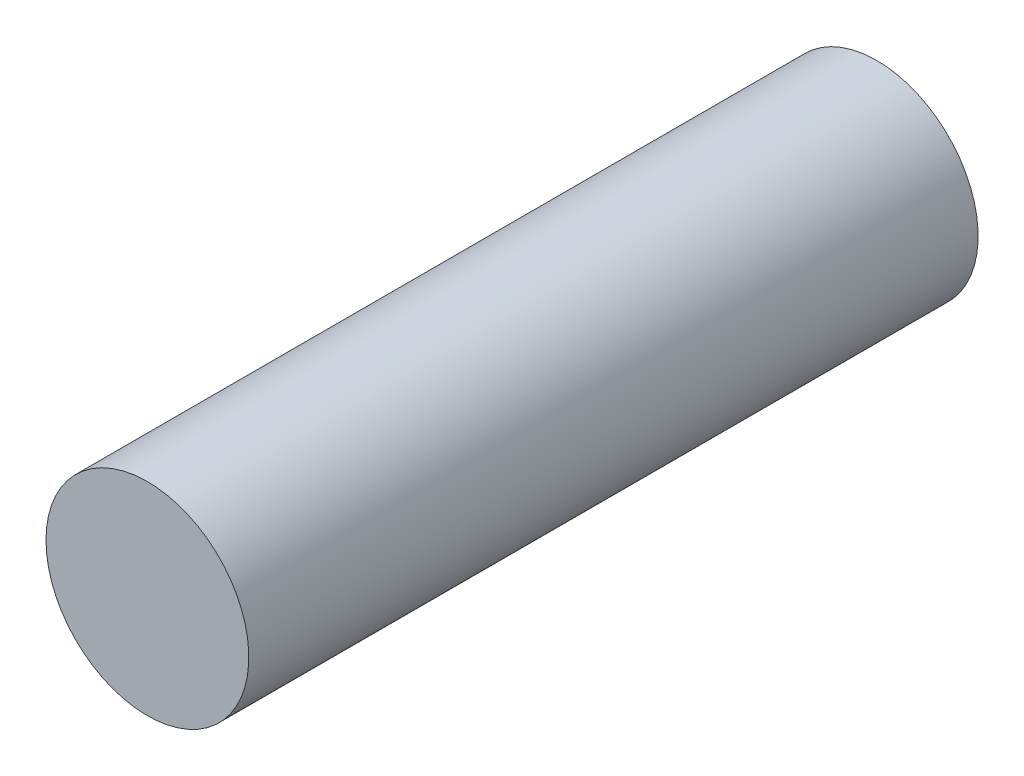
ISO-10303-21;
HEADER;
FILE_DESCRIPTION(('STEP AP214'),'2;1');
FILE_NAME('part.step','',(''),(''),'','','');
FILE_SCHEMA(('AUTOMOTIVE_DESIGN { 1 0 10303 214 1 1 1 1 }'));
ENDSEC;
DATA;
#1=APPLICATION_CONTEXT('core data for automotive mechanical design processes');
#2=APPLICATION_PROTOCOL_DEFINITION('international standard','automotive_design',2000,#1);
#3=PRODUCT_CONTEXT('',#1,'mechanical');
#4=PRODUCT('Part','Part','',(#3));
#5=PRODUCT_RELATED_PRODUCT_CATEGORY('part','',(#4));
#6=PRODUCT_DEFINITION_FORMATION('','',#4);
#7=PRODUCT_DEFINITION_CONTEXT('part definition',#1,'design');
#8=PRODUCT_DEFINITION('design','',#6,#7);
#9=PRODUCT_DEFINITION_SHAPE('','',#8);
#10=(LENGTH_UNIT() NAMED_UNIT(*) SI_UNIT(.MILLI.,.METRE.));
#11=(NAMED_UNIT(*) PLANE_ANGLE_UNIT() SI_UNIT($,.RADIAN.));
#12=(NAMED_UNIT(*) SI_UNIT($,.STERADIAN.) SOLID_ANGLE_UNIT());
#13=UNCERTAINTY_MEASURE_WITH_UNIT(LENGTH_MEASURE(1.E-05),#10,'distance_accuracy_value','');
#14=(GEOMETRIC_REPRESENTATION_CONTEXT(3) GLOBAL_UNCERTAINTY_ASSIGNED_CONTEXT((#13)) GLOBAL_UNIT_ASSIGNED_CONTEXT((#10,
#11,#12)) REPRESENTATION_CONTEXT('',''));
#15=CARTESIAN_POINT('',(0.,0.,0.));
#16=DIRECTION('',(0.,0.,1.));
#17=DIRECTION('',(1.,0.,0.));
#18=AXIS2_PLACEMENT_3D('',#15,#16,#17);
#19=CARTESIAN_POINT('',(0.,0.,11.8745));
#20=DIRECTION('',(0.,0.,-1.));
#21=DIRECTION('',(-1.,0.,0.));
#22=AXIS2_PLACEMENT_3D('',#19,#20,#21);
#23=CYLINDRICAL_SURFACE('',#22,3.302);
#24=CARTESIAN_POINT('',(0.,0.,11.8745));
#25=DIRECTION('',(0.,0.,1.));
#26=DIRECTION('',(1.,0.,0.));
#27=AXIS2_PLACEMENT_3D('',#24,#25,#26);
#28=CIRCLE('',#27,3.302);
#29=CARTESIAN_POINT('',(-3.302,0.,11.8745));
#30=VERTEX_POINT('',#29);
#31=EDGE_CURVE('E10',#30,#30,#28,.T.);
#32=CARTESIAN_POINT('',(0.,0.,-11.8745));
#33=DIRECTION('',(0.,0.,1.));
#34=DIRECTION('',(1.,0.,0.));
#35=AXIS2_PLACEMENT_3D('',#32,#33,#34);
#36=CIRCLE('',#35,3.302);
#37=CARTESIAN_POINT('',(-3.302,0.,-11.8745));
#38=VERTEX_POINT('',#37);
#39=EDGE_CURVE('E48',#38,#38,#36,.T.);
#40=CARTESIAN_POINT('',(-3.302,0.,11.8745));
#41=CARTESIAN_POINT('',(-3.302,0.,11.6271145833333));
#42=CARTESIAN_POINT('',(-3.302,0.,11.3797291666667));
#43=CARTESIAN_POINT('',(-3.302,0.,10.8849583333333));
#44=CARTESIAN_POINT('',(-3.302,0.,10.6375729166667));
#45=CARTESIAN_POINT('',(-3.302,0.,10.1428020833333));
#46=CARTESIAN_POINT('',(-3.302,0.,9.89541666666667));
#47=CARTESIAN_POINT('',(-3.302,0.,9.40064583333333));
#48=CARTESIAN_POINT('',(-3.302,0.,9.15326041666667));
#49=CARTESIAN_POINT('',(-3.302,0.,8.65848958333333));
#50=CARTESIAN_POINT('',(-3.302,0.,8.41110416666667));
#51=CARTESIAN_POINT('',(-3.302,0.,7.91633333333333));
#52=CARTESIAN_POINT('',(-3.302,0.,7.66894791666667));
#53=CARTESIAN_POINT('',(-3.302,0.,7.17417708333333));
#54=CARTESIAN_POINT('',(-3.302,0.,6.92679166666667));
#55=CARTESIAN_POINT('',(-3.302,0.,6.43202083333333));
#56=CARTESIAN_POINT('',(-3.302,0.,6.18463541666666));
#57=CARTESIAN_POINT('',(-3.302,0.,5.68986458333333));
#58=CARTESIAN_POINT('',(-3.302,0.,5.44247916666666));
#59=CARTESIAN_POINT('',(-3.302,0.,4.94770833333333));
#60=CARTESIAN_POINT('',(-3.302,0.,4.70032291666666));
#61=CARTESIAN_POINT('',(-3.302,0.,4.20555208333333));
#62=CARTESIAN_POINT('',(-3.302,0.,3.95816666666667));
#63=CARTESIAN_POINT('',(-3.302,0.,3.46339583333333));
#64=CARTESIAN_POINT('',(-3.302,0.,3.21601041666667));
#65=CARTESIAN_POINT('',(-3.302,0.,2.72123958333333));
#66=CARTESIAN_POINT('',(-3.302,0.,2.47385416666667));
#67=CARTESIAN_POINT('',(-3.302,0.,1.97908333333333));
#68=CARTESIAN_POINT('',(-3.302,0.,1.73169791666667));
#69=CARTESIAN_POINT('',(-3.302,0.,1.23692708333333));
#70=CARTESIAN_POINT('',(-3.302,0.,0.989541666666666));
#71=CARTESIAN_POINT('',(-3.302,0.,0.494770833333332));
#72=CARTESIAN_POINT('',(-3.302,0.,0.247385416666665));
#73=CARTESIAN_POINT('',(-3.302,0.,-0.247385416666669));
#74=CARTESIAN_POINT('',(-3.302,0.,-0.494770833333336));
#75=CARTESIAN_POINT('',(-3.302,0.,-0.989541666666669));
#76=CARTESIAN_POINT('',(-3.302,0.,-1.23692708333334));
#77=CARTESIAN_POINT('',(-3.302,0.,-1.73169791666667));
#78=CARTESIAN_POINT('',(-3.302,0.,-1.97908333333334));
#79=CARTESIAN_POINT('',(-3.302,0.,-2.47385416666667));
#80=CARTESIAN_POINT('',(-3.302,0.,-2.72123958333334));
#81=CARTESIAN_POINT('',(-3.302,0.,-3.21601041666667));
#82=CARTESIAN_POINT('',(-3.302,0.,-3.46339583333334));
#83=CARTESIAN_POINT('',(-3.302,0.,-3.95816666666667));
#84=CARTESIAN_POINT('',(-3.302,0.,-4.20555208333333));
#85=CARTESIAN_POINT('',(-3.302,0.,-4.70032291666667));
#86=CARTESIAN_POINT('',(-3.302,0.,-4.94770833333333));
#87=CARTESIAN_POINT('',(-3.302,0.,-5.44247916666667));
#88=CARTESIAN_POINT('',(-3.302,0.,-5.68986458333333));
#89=CARTESIAN_POINT('',(-3.302,0.,-6.18463541666667));
#90=CARTESIAN_POINT('',(-3.302,0.,-6.43202083333334));
#91=CARTESIAN_POINT('',(-3.302,0.,-6.92679166666667));
#92=CARTESIAN_POINT('',(-3.302,0.,-7.17417708333334));
#93=CARTESIAN_POINT('',(-3.302,0.,-7.66894791666667));
#94=CARTESIAN_POINT('',(-3.302,0.,-7.91633333333334));
#95=CARTESIAN_POINT('',(-3.302,0.,-8.41110416666667));
#96=CARTESIAN_POINT('',(-3.302,0.,-8.65848958333333));
#97=CARTESIAN_POINT('',(-3.302,0.,-9.15326041666667));
#98=CARTESIAN_POINT('',(-3.302,0.,-9.40064583333333));
#99=CARTESIAN_POINT('',(-3.302,0.,-9.89541666666667));
#100=CARTESIAN_POINT('',(-3.302,0.,-10.1428020833333));
#101=CARTESIAN_POINT('',(-3.302,0.,-10.6375729166667));
#102=CARTESIAN_POINT('',(-3.302,0.,-10.8849583333333));
#103=CARTESIAN_POINT('',(-3.302,0.,-11.3797291666667));
#104=CARTESIAN_POINT('',(-3.302,0.,-11.6271145833333));
#105=CARTESIAN_POINT('',(-3.302,0.,-11.8745));
#106=B_SPLINE_CURVE_WITH_KNOTS('',3,(#40,#41,#42,#43,#44,#45,#46,#47,#48,#49,#50,#51,#52,#53,
#54,#55,#56,#57,#58,#59,#60,#61,#62,#63,#64,#65,#66,#67,#68,#69,#70,#71,#72,#73,#74,#75,#76,#77,
#78,#79,#80,#81,#82,#83,#84,#85,#86,#87,#88,#89,#90,#91,#92,#93,#94,#95,#96,#97,#98,#99,#100,
#101,#102,#103,#104,#105),.UNSPECIFIED.,.F.,.F.,(4,2,2,2,2,2,2,2,2,2,2,2,2,2,2,2,2,2,2,2,2,2,2,
2,2,2,2,2,2,2,2,2,4),(0.,0.742156250000001,1.4843125,2.22646875,2.968625,3.71078125,4.4529375,
5.19509375,5.93725,6.67940625,7.4215625,8.16371875,8.905875,9.64803125,10.3901875,11.13234375,
11.8745,12.61665625,13.3588125,14.10096875,14.843125,15.58528125,16.3274375,17.06959375,
17.81175,18.55390625,19.2960625,20.03821875,20.780375,21.52253125,22.2646875,23.00684375,
23.749),.UNSPECIFIED.);
#107=EDGE_CURVE('BSEAM45',#30,#38,#106,.T.);
#108=ORIENTED_EDGE('',*,*,#31,.F.);
#109=ORIENTED_EDGE('',*,*,#39,.T.);
#110=ORIENTED_EDGE('',*,*,#107,.T.);
#111=ORIENTED_EDGE('',*,*,#107,.F.);
#112=EDGE_LOOP('',(#108,#110,#109,#111));
#113=FACE_BOUND('',#112,.T.);
#114=ADVANCED_FACE('F45',(#113),#23,.T.);
#115=CARTESIAN_POINT('',(0.,0.,11.8745));
#116=DIRECTION('',(0.,0.,1.));
#117=DIRECTION('',(1.,0.,0.));
#118=AXIS2_PLACEMENT_3D('',#115,#116,#117);
#119=PLANE('',#118);
#120=ORIENTED_EDGE('',*,*,#31,.T.);
#121=EDGE_LOOP('',(#120));
#122=FACE_BOUND('',#121,.T.);
#123=ADVANCED_FACE('F62',(#122),#119,.T.);
#124=CARTESIAN_POINT('',(0.,0.,-11.8745));
#125=DIRECTION('',(0.,0.,1.));
#126=DIRECTION('',(1.,0.,0.));
#127=AXIS2_PLACEMENT_3D('',#124,#125,#126);
#128=PLANE('',#127);
#129=ORIENTED_EDGE('',*,*,#39,.F.);
#130=EDGE_LOOP('',(#129));
#131=FACE_BOUND('',#130,.T.);
#132=ADVANCED_FACE('F60',(#131),#128,.F.);
#133=CLOSED_SHELL('',(#114,#123,#132));
#134=MANIFOLD_SOLID_BREP('B2',#133);
#135=ADVANCED_BREP_SHAPE_REPRESENTATION('',(#18,#134),#14);
#136=SHAPE_DEFINITION_REPRESENTATION(#9,#135);
ENDSEC;
END-ISO-10303-21;
